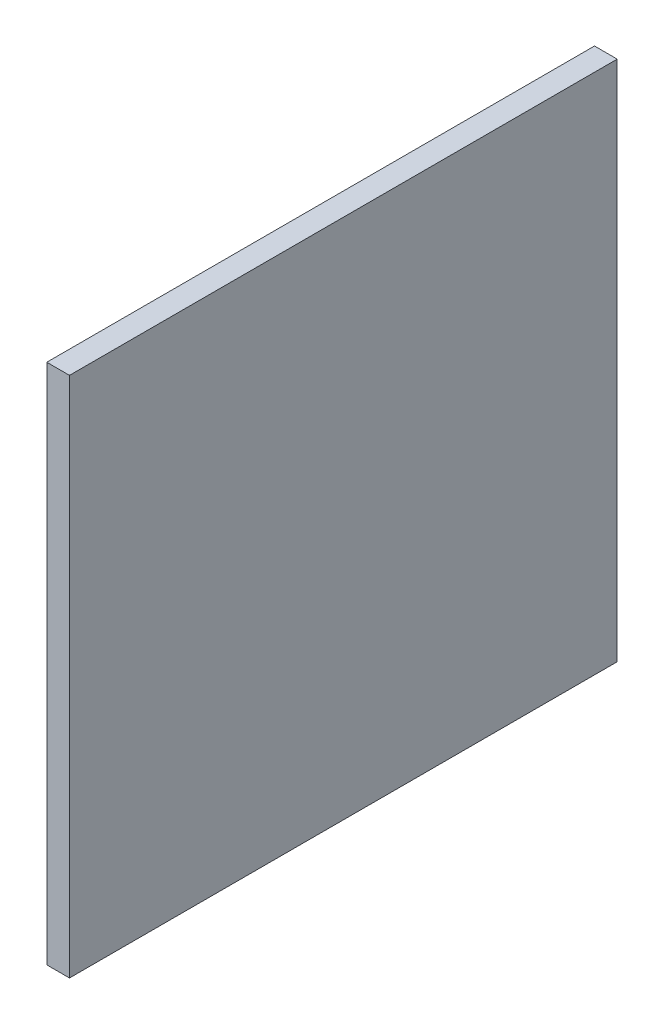
ISO-10303-21;
HEADER;
FILE_DESCRIPTION(('STEP AP214'),'2;1');
FILE_NAME('part.step','',(''),(''),'','','');
FILE_SCHEMA(('AUTOMOTIVE_DESIGN { 1 0 10303 214 1 1 1 1 }'));
ENDSEC;
DATA;
#1=APPLICATION_CONTEXT('core data for automotive mechanical design processes');
#2=APPLICATION_PROTOCOL_DEFINITION('international standard','automotive_design',2000,#1);
#3=PRODUCT_CONTEXT('',#1,'mechanical');
#4=PRODUCT('Part','Part','',(#3));
#5=PRODUCT_RELATED_PRODUCT_CATEGORY('part','',(#4));
#6=PRODUCT_DEFINITION_FORMATION('','',#4);
#7=PRODUCT_DEFINITION_CONTEXT('part definition',#1,'design');
#8=PRODUCT_DEFINITION('design','',#6,#7);
#9=PRODUCT_DEFINITION_SHAPE('','',#8);
#10=(LENGTH_UNIT() NAMED_UNIT(*) SI_UNIT(.MILLI.,.METRE.));
#11=(NAMED_UNIT(*) PLANE_ANGLE_UNIT() SI_UNIT($,.RADIAN.));
#12=(NAMED_UNIT(*) SI_UNIT($,.STERADIAN.) SOLID_ANGLE_UNIT());
#13=UNCERTAINTY_MEASURE_WITH_UNIT(LENGTH_MEASURE(1.E-05),#10,'distance_accuracy_value','');
#14=(GEOMETRIC_REPRESENTATION_CONTEXT(3) GLOBAL_UNCERTAINTY_ASSIGNED_CONTEXT((#13)) GLOBAL_UNIT_ASSIGNED_CONTEXT((#10,
#11,#12)) REPRESENTATION_CONTEXT('',''));
#15=CARTESIAN_POINT('',(0.,0.,0.));
#16=DIRECTION('',(0.,0.,1.));
#17=DIRECTION('',(1.,0.,0.));
#18=AXIS2_PLACEMENT_3D('',#15,#16,#17);
#19=CARTESIAN_POINT('',(0.,0.,7.86063673348532));
#20=DIRECTION('',(0.,0.,1.));
#21=DIRECTION('',(1.,0.,0.));
#22=AXIS2_PLACEMENT_3D('',#19,#20,#21);
#23=PLANE('',#22);
#24=DIRECTION('',(0.,-1.,0.));
#25=VECTOR('',#24,1.);
#26=CARTESIAN_POINT('',(51.,69.8959813156576,7.86063673348532));
#27=LINE('',#26,#25);
#28=CARTESIAN_POINT('',(51.,69.8959813156576,7.86063673348532));
#29=VERTEX_POINT('',#28);
#30=CARTESIAN_POINT('',(51.,-45.,7.86063673348532));
#31=VERTEX_POINT('',#30);
#32=EDGE_CURVE('E92',#29,#31,#27,.T.);
#33=ORIENTED_EDGE('',*,*,#32,.F.);
#34=DIRECTION('',(-1.,0.,0.));
#35=VECTOR('',#34,1.);
#36=CARTESIAN_POINT('',(51.,69.8959813156576,7.86063673348532));
#37=LINE('',#36,#35);
#38=CARTESIAN_POINT('',(56.,69.8959813156576,7.86063673348532));
#39=VERTEX_POINT('',#38);
#40=EDGE_CURVE('E103',#39,#29,#37,.T.);
#41=ORIENTED_EDGE('',*,*,#40,.F.);
#42=DIRECTION('',(0.,1.,0.));
#43=VECTOR('',#42,1.);
#44=CARTESIAN_POINT('',(56.,69.8959813156576,7.86063673348532));
#45=LINE('',#44,#43);
#46=CARTESIAN_POINT('',(56.,-45.,7.86063673348532));
#47=VERTEX_POINT('',#46);
#48=EDGE_CURVE('E94',#47,#39,#45,.T.);
#49=ORIENTED_EDGE('',*,*,#48,.F.);
#50=DIRECTION('',(1.,0.,0.));
#51=VECTOR('',#50,1.);
#52=CARTESIAN_POINT('',(51.,-45.,7.86063673348532));
#53=LINE('',#52,#51);
#54=EDGE_CURVE('E84',#31,#47,#53,.T.);
#55=ORIENTED_EDGE('',*,*,#54,.F.);
#56=EDGE_LOOP('',(#33,#41,#49,#55));
#57=FACE_BOUND('',#56,.T.);
#58=ADVANCED_FACE('F42',(#57),#23,.F.);
#59=CARTESIAN_POINT('',(51.,69.8959813156576,243.446849559353));
#60=DIRECTION('',(0.,-1.,0.));
#61=DIRECTION('',(0.,0.,-1.));
#62=AXIS2_PLACEMENT_3D('',#59,#60,#61);
#63=PLANE('',#62);
#64=DIRECTION('',(0.,0.,-1.));
#65=VECTOR('',#64,1.);
#66=CARTESIAN_POINT('',(51.,69.8959813156576,243.446849559353));
#67=LINE('',#66,#65);
#68=CARTESIAN_POINT('',(51.,69.8959813156576,128.442125645559));
#69=VERTEX_POINT('',#68);
#70=EDGE_CURVE('E97',#69,#29,#67,.T.);
#71=ORIENTED_EDGE('',*,*,#70,.F.);
#72=DIRECTION('',(1.,0.,0.));
#73=VECTOR('',#72,1.);
#74=CARTESIAN_POINT('',(51.,69.8959813156576,128.442125645559));
#75=LINE('',#74,#73);
#76=CARTESIAN_POINT('',(56.,69.8959813156576,128.442125645559));
#77=VERTEX_POINT('',#76);
#78=EDGE_CURVE('E46',#69,#77,#75,.T.);
#79=ORIENTED_EDGE('',*,*,#78,.T.);
#80=DIRECTION('',(0.,0.,-1.));
#81=VECTOR('',#80,1.);
#82=CARTESIAN_POINT('',(56.,69.8959813156576,243.446849559353));
#83=LINE('',#82,#81);
#84=EDGE_CURVE('E106',#77,#39,#83,.T.);
#85=ORIENTED_EDGE('',*,*,#84,.T.);
#86=ORIENTED_EDGE('',*,*,#40,.T.);
#87=EDGE_LOOP('',(#71,#79,#85,#86));
#88=FACE_BOUND('',#87,.T.);
#89=ADVANCED_FACE('F115',(#88),#63,.F.);
#90=CARTESIAN_POINT('',(56.,69.8959813156576,243.446849559353));
#91=DIRECTION('',(-1.,0.,0.));
#92=DIRECTION('',(0.,-1.,0.));
#93=AXIS2_PLACEMENT_3D('',#90,#91,#92);
#94=PLANE('',#93);
#95=ORIENTED_EDGE('',*,*,#84,.F.);
#96=DIRECTION('',(0.,-1.,0.));
#97=VECTOR('',#96,1.);
#98=CARTESIAN_POINT('',(56.,69.8959813156576,128.442125645559));
#99=LINE('',#98,#97);
#100=CARTESIAN_POINT('',(56.,-45.,128.442125645559));
#101=VERTEX_POINT('',#100);
#102=EDGE_CURVE('E112',#77,#101,#99,.T.);
#103=ORIENTED_EDGE('',*,*,#102,.T.);
#104=DIRECTION('',(0.,0.,-1.));
#105=VECTOR('',#104,1.);
#106=CARTESIAN_POINT('',(56.,-45.,243.446849559353));
#107=LINE('',#106,#105);
#108=EDGE_CURVE('E88',#101,#47,#107,.T.);
#109=ORIENTED_EDGE('',*,*,#108,.T.);
#110=ORIENTED_EDGE('',*,*,#48,.T.);
#111=EDGE_LOOP('',(#95,#103,#109,#110));
#112=FACE_BOUND('',#111,.T.);
#113=ADVANCED_FACE('F111',(#112),#94,.F.);
#114=CARTESIAN_POINT('',(51.,-45.,243.446849559353));
#115=DIRECTION('',(0.,1.,0.));
#116=DIRECTION('',(0.,0.,1.));
#117=AXIS2_PLACEMENT_3D('',#114,#115,#116);
#118=PLANE('',#117);
#119=ORIENTED_EDGE('',*,*,#108,.F.);
#120=DIRECTION('',(-1.,0.,0.));
#121=VECTOR('',#120,1.);
#122=CARTESIAN_POINT('',(51.,-45.,128.442125645559));
#123=LINE('',#122,#121);
#124=CARTESIAN_POINT('',(51.,-45.,128.442125645559));
#125=VERTEX_POINT('',#124);
#126=EDGE_CURVE('E51',#101,#125,#123,.T.);
#127=ORIENTED_EDGE('',*,*,#126,.T.);
#128=DIRECTION('',(0.,0.,-1.));
#129=VECTOR('',#128,1.);
#130=CARTESIAN_POINT('',(51.,-45.,243.446849559353));
#131=LINE('',#130,#129);
#132=EDGE_CURVE('E81',#125,#31,#131,.T.);
#133=ORIENTED_EDGE('',*,*,#132,.T.);
#134=ORIENTED_EDGE('',*,*,#54,.T.);
#135=EDGE_LOOP('',(#119,#127,#133,#134));
#136=FACE_BOUND('',#135,.T.);
#137=ADVANCED_FACE('F83',(#136),#118,.F.);
#138=CARTESIAN_POINT('',(51.,69.8959813156576,243.446849559353));
#139=DIRECTION('',(1.,0.,0.));
#140=DIRECTION('',(0.,0.,-1.));
#141=AXIS2_PLACEMENT_3D('',#138,#139,#140);
#142=PLANE('',#141);
#143=ORIENTED_EDGE('',*,*,#132,.F.);
#144=DIRECTION('',(0.,1.,0.));
#145=VECTOR('',#144,1.);
#146=CARTESIAN_POINT('',(51.,69.8959813156576,128.442125645559));
#147=LINE('',#146,#145);
#148=EDGE_CURVE('E11',#125,#69,#147,.T.);
#149=ORIENTED_EDGE('',*,*,#148,.T.);
#150=ORIENTED_EDGE('',*,*,#70,.T.);
#151=ORIENTED_EDGE('',*,*,#32,.T.);
#152=EDGE_LOOP('',(#143,#149,#150,#151));
#153=FACE_BOUND('',#152,.T.);
#154=ADVANCED_FACE('F44',(#153),#142,.F.);
#155=CARTESIAN_POINT('',(51.,74.8959813156576,128.442125645559));
#156=DIRECTION('',(0.,0.,-1.));
#157=DIRECTION('',(-1.,0.,0.));
#158=AXIS2_PLACEMENT_3D('',#155,#156,#157);
#159=PLANE('',#158);
#160=ORIENTED_EDGE('',*,*,#126,.F.);
#161=ORIENTED_EDGE('',*,*,#102,.F.);
#162=ORIENTED_EDGE('',*,*,#78,.F.);
#163=ORIENTED_EDGE('',*,*,#148,.F.);
#164=EDGE_LOOP('',(#160,#161,#162,#163));
#165=FACE_BOUND('',#164,.T.);
#166=ADVANCED_FACE('F129',(#165),#159,.F.);
#167=CLOSED_SHELL('',(#58,#89,#113,#137,#154,#166));
#168=MANIFOLD_SOLID_BREP('B2',#167);
#169=ADVANCED_BREP_SHAPE_REPRESENTATION('',(#18,#168),#14);
#170=SHAPE_DEFINITION_REPRESENTATION(#9,#169);
ENDSEC;
END-ISO-10303-21;
